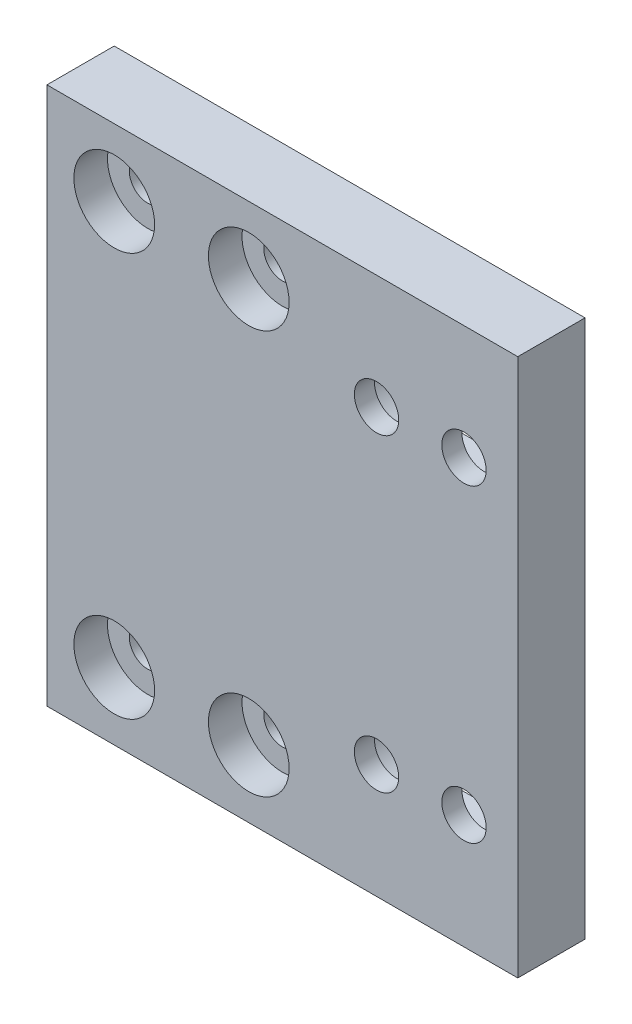
ISO-10303-21;
HEADER;
FILE_DESCRIPTION(('STEP AP214'),'2;1');
FILE_NAME('part.step','',(''),(''),'','','');
FILE_SCHEMA(('AUTOMOTIVE_DESIGN { 1 0 10303 214 1 1 1 1 }'));
ENDSEC;
DATA;
#1=APPLICATION_CONTEXT('core data for automotive mechanical design processes');
#2=APPLICATION_PROTOCOL_DEFINITION('international standard','automotive_design',2000,#1);
#3=PRODUCT_CONTEXT('',#1,'mechanical');
#4=PRODUCT('Part','Part','',(#3));
#5=PRODUCT_RELATED_PRODUCT_CATEGORY('part','',(#4));
#6=PRODUCT_DEFINITION_FORMATION('','',#4);
#7=PRODUCT_DEFINITION_CONTEXT('part definition',#1,'design');
#8=PRODUCT_DEFINITION('design','',#6,#7);
#9=PRODUCT_DEFINITION_SHAPE('','',#8);
#10=(LENGTH_UNIT() NAMED_UNIT(*) SI_UNIT(.MILLI.,.METRE.));
#11=(NAMED_UNIT(*) PLANE_ANGLE_UNIT() SI_UNIT($,.RADIAN.));
#12=(NAMED_UNIT(*) SI_UNIT($,.STERADIAN.) SOLID_ANGLE_UNIT());
#13=UNCERTAINTY_MEASURE_WITH_UNIT(LENGTH_MEASURE(1.E-05),#10,'distance_accuracy_value','');
#14=(GEOMETRIC_REPRESENTATION_CONTEXT(3) GLOBAL_UNCERTAINTY_ASSIGNED_CONTEXT((#13)) GLOBAL_UNIT_ASSIGNED_CONTEXT((#10,
#11,#12)) REPRESENTATION_CONTEXT('',''));
#15=CARTESIAN_POINT('',(0.,0.,0.));
#16=DIRECTION('',(0.,0.,1.));
#17=DIRECTION('',(1.,0.,0.));
#18=AXIS2_PLACEMENT_3D('',#15,#16,#17);
#19=CARTESIAN_POINT('',(0.821863894176577,24.1380472116371,10.));
#20=DIRECTION('',(0.,0.,-1.));
#21=DIRECTION('',(-1.,0.,0.));
#22=AXIS2_PLACEMENT_3D('',#19,#20,#21);
#23=CYLINDRICAL_SURFACE('',#22,3.3);
#24=CARTESIAN_POINT('',(0.821863894176577,24.1380472116371,10.));
#25=DIRECTION('',(0.,0.,1.));
#26=DIRECTION('',(1.,0.,0.));
#27=AXIS2_PLACEMENT_3D('',#24,#25,#26);
#28=CIRCLE('',#27,3.3);
#29=CARTESIAN_POINT('',(4.12186389417658,24.1380472116371,10.));
#30=VERTEX_POINT('',#29);
#31=EDGE_CURVE('E250',#30,#30,#28,.T.);
#32=ORIENTED_EDGE('',*,*,#31,.T.);
#33=EDGE_LOOP('',(#32));
#34=FACE_BOUND('',#33,.T.);
#35=CARTESIAN_POINT('',(0.821863894176577,24.1380472116371,7.));
#36=DIRECTION('',(0.,0.,-1.));
#37=DIRECTION('',(-1.,0.,0.));
#38=AXIS2_PLACEMENT_3D('',#35,#36,#37);
#39=CIRCLE('',#38,3.3);
#40=CARTESIAN_POINT('',(-2.47813610582342,24.1380472116371,7.));
#41=VERTEX_POINT('',#40);
#42=EDGE_CURVE('E200',#41,#41,#39,.T.);
#43=ORIENTED_EDGE('',*,*,#42,.T.);
#44=EDGE_LOOP('',(#43));
#45=FACE_BOUND('',#44,.T.);
#46=ADVANCED_FACE('F37',(#34,#45),#23,.F.);
#47=CARTESIAN_POINT('',(-12.1781361058234,24.1380472116371,10.));
#48=DIRECTION('',(0.,0.,-1.));
#49=DIRECTION('',(-1.,0.,0.));
#50=AXIS2_PLACEMENT_3D('',#47,#48,#49);
#51=CYLINDRICAL_SURFACE('',#50,3.3);
#52=CARTESIAN_POINT('',(-12.1781361058234,24.1380472116371,10.));
#53=DIRECTION('',(0.,0.,1.));
#54=DIRECTION('',(1.,0.,0.));
#55=AXIS2_PLACEMENT_3D('',#52,#53,#54);
#56=CIRCLE('',#55,3.3);
#57=CARTESIAN_POINT('',(-8.87813610582342,24.1380472116371,10.));
#58=VERTEX_POINT('',#57);
#59=EDGE_CURVE('E247',#58,#58,#56,.T.);
#60=ORIENTED_EDGE('',*,*,#59,.T.);
#61=EDGE_LOOP('',(#60));
#62=FACE_BOUND('',#61,.T.);
#63=CARTESIAN_POINT('',(-12.1781361058234,24.1380472116371,7.));
#64=DIRECTION('',(0.,0.,-1.));
#65=DIRECTION('',(-1.,0.,0.));
#66=AXIS2_PLACEMENT_3D('',#63,#64,#65);
#67=CIRCLE('',#66,3.3);
#68=CARTESIAN_POINT('',(-15.4781361058234,24.1380472116371,7.));
#69=VERTEX_POINT('',#68);
#70=EDGE_CURVE('E41',#69,#69,#67,.T.);
#71=ORIENTED_EDGE('',*,*,#70,.T.);
#72=EDGE_LOOP('',(#71));
#73=FACE_BOUND('',#72,.T.);
#74=ADVANCED_FACE('F382',(#62,#73),#51,.F.);
#75=CARTESIAN_POINT('',(-12.1781361058234,-21.8619527883629,10.));
#76=DIRECTION('',(0.,0.,-1.));
#77=DIRECTION('',(-1.,0.,0.));
#78=AXIS2_PLACEMENT_3D('',#75,#76,#77);
#79=CYLINDRICAL_SURFACE('',#78,3.3);
#80=CARTESIAN_POINT('',(-12.1781361058234,-21.8619527883629,10.));
#81=DIRECTION('',(0.,0.,1.));
#82=DIRECTION('',(1.,0.,0.));
#83=AXIS2_PLACEMENT_3D('',#80,#81,#82);
#84=CIRCLE('',#83,3.3);
#85=CARTESIAN_POINT('',(-8.87813610582342,-21.8619527883629,10.));
#86=VERTEX_POINT('',#85);
#87=EDGE_CURVE('E244',#86,#86,#84,.T.);
#88=ORIENTED_EDGE('',*,*,#87,.T.);
#89=EDGE_LOOP('',(#88));
#90=FACE_BOUND('',#89,.T.);
#91=CARTESIAN_POINT('',(-12.1781361058234,-21.8619527883629,7.));
#92=DIRECTION('',(0.,0.,-1.));
#93=DIRECTION('',(-1.,0.,0.));
#94=AXIS2_PLACEMENT_3D('',#91,#92,#93);
#95=CIRCLE('',#94,3.3);
#96=CARTESIAN_POINT('',(-15.4781361058234,-21.8619527883629,7.));
#97=VERTEX_POINT('',#96);
#98=EDGE_CURVE('E197',#97,#97,#95,.T.);
#99=ORIENTED_EDGE('',*,*,#98,.T.);
#100=EDGE_LOOP('',(#99));
#101=FACE_BOUND('',#100,.T.);
#102=ADVANCED_FACE('F373',(#90,#101),#79,.F.);
#103=CARTESIAN_POINT('',(0.821863894176577,-21.8619527883629,10.));
#104=DIRECTION('',(0.,0.,-1.));
#105=DIRECTION('',(-1.,0.,0.));
#106=AXIS2_PLACEMENT_3D('',#103,#104,#105);
#107=CYLINDRICAL_SURFACE('',#106,3.3);
#108=CARTESIAN_POINT('',(0.821863894176577,-21.8619527883629,10.));
#109=DIRECTION('',(0.,0.,1.));
#110=DIRECTION('',(1.,0.,0.));
#111=AXIS2_PLACEMENT_3D('',#108,#109,#110);
#112=CIRCLE('',#111,3.3);
#113=CARTESIAN_POINT('',(4.12186389417658,-21.8619527883629,10.));
#114=VERTEX_POINT('',#113);
#115=EDGE_CURVE('E241',#114,#114,#112,.T.);
#116=ORIENTED_EDGE('',*,*,#115,.T.);
#117=EDGE_LOOP('',(#116));
#118=FACE_BOUND('',#117,.T.);
#119=CARTESIAN_POINT('',(0.821863894176577,-21.8619527883629,7.));
#120=DIRECTION('',(0.,0.,-1.));
#121=DIRECTION('',(-1.,0.,0.));
#122=AXIS2_PLACEMENT_3D('',#119,#120,#121);
#123=CIRCLE('',#122,3.3);
#124=CARTESIAN_POINT('',(-2.47813610582342,-21.8619527883629,7.));
#125=VERTEX_POINT('',#124);
#126=EDGE_CURVE('E164',#125,#125,#123,.T.);
#127=ORIENTED_EDGE('',*,*,#126,.T.);
#128=EDGE_LOOP('',(#127));
#129=FACE_BOUND('',#128,.T.);
#130=ADVANCED_FACE('F291',(#118,#129),#107,.F.);
#131=CARTESIAN_POINT('',(-51.1781361058234,31.1380472116371,10.));
#132=DIRECTION('',(0.,0.,-1.));
#133=DIRECTION('',(-1.,0.,0.));
#134=AXIS2_PLACEMENT_3D('',#131,#132,#133);
#135=CYLINDRICAL_SURFACE('',#134,2.75);
#136=CARTESIAN_POINT('',(-51.1781361058234,31.1380472116371,0.));
#137=DIRECTION('',(0.,0.,1.));
#138=DIRECTION('',(1.,0.,0.));
#139=AXIS2_PLACEMENT_3D('',#136,#137,#138);
#140=CIRCLE('',#139,2.75);
#141=CARTESIAN_POINT('',(-48.4281361058234,31.1380472116371,0.));
#142=VERTEX_POINT('',#141);
#143=EDGE_CURVE('E238',#142,#142,#140,.T.);
#144=ORIENTED_EDGE('',*,*,#143,.F.);
#145=EDGE_LOOP('',(#144));
#146=FACE_BOUND('',#145,.T.);
#147=CARTESIAN_POINT('',(-51.1781361058234,31.1380472116371,5.));
#148=DIRECTION('',(0.,0.,1.));
#149=DIRECTION('',(1.,0.,0.));
#150=AXIS2_PLACEMENT_3D('',#147,#148,#149);
#151=CIRCLE('',#150,2.75);
#152=CARTESIAN_POINT('',(-48.4281361058234,31.1380472116371,5.));
#153=VERTEX_POINT('',#152);
#154=EDGE_CURVE('E232',#153,#153,#151,.T.);
#155=ORIENTED_EDGE('',*,*,#154,.T.);
#156=EDGE_LOOP('',(#155));
#157=FACE_BOUND('',#156,.T.);
#158=ADVANCED_FACE('F372',(#146,#157),#135,.F.);
#159=CARTESIAN_POINT('',(-31.1781361058234,31.1380472116371,10.));
#160=DIRECTION('',(0.,0.,-1.));
#161=DIRECTION('',(-1.,0.,0.));
#162=AXIS2_PLACEMENT_3D('',#159,#160,#161);
#163=CYLINDRICAL_SURFACE('',#162,2.75);
#164=CARTESIAN_POINT('',(-31.1781361058234,31.1380472116371,0.));
#165=DIRECTION('',(0.,0.,1.));
#166=DIRECTION('',(1.,0.,0.));
#167=AXIS2_PLACEMENT_3D('',#164,#165,#166);
#168=CIRCLE('',#167,2.75);
#169=CARTESIAN_POINT('',(-28.4281361058234,31.1380472116371,0.));
#170=VERTEX_POINT('',#169);
#171=EDGE_CURVE('E235',#170,#170,#168,.T.);
#172=ORIENTED_EDGE('',*,*,#171,.F.);
#173=EDGE_LOOP('',(#172));
#174=FACE_BOUND('',#173,.T.);
#175=CARTESIAN_POINT('',(-31.1781361058234,31.1380472116371,5.));
#176=DIRECTION('',(0.,0.,1.));
#177=DIRECTION('',(1.,0.,0.));
#178=AXIS2_PLACEMENT_3D('',#175,#176,#177);
#179=CIRCLE('',#178,2.75);
#180=CARTESIAN_POINT('',(-28.4281361058234,31.1380472116371,5.));
#181=VERTEX_POINT('',#180);
#182=EDGE_CURVE('E284',#181,#181,#179,.T.);
#183=ORIENTED_EDGE('',*,*,#182,.T.);
#184=EDGE_LOOP('',(#183));
#185=FACE_BOUND('',#184,.T.);
#186=ADVANCED_FACE('F379',(#174,#185),#163,.F.);
#187=CARTESIAN_POINT('',(-31.1781361058234,-28.8619527883629,10.));
#188=DIRECTION('',(0.,0.,-1.));
#189=DIRECTION('',(-1.,0.,0.));
#190=AXIS2_PLACEMENT_3D('',#187,#188,#189);
#191=CYLINDRICAL_SURFACE('',#190,2.75);
#192=CARTESIAN_POINT('',(-31.1781361058234,-28.8619527883629,0.));
#193=DIRECTION('',(0.,0.,1.));
#194=DIRECTION('',(1.,0.,0.));
#195=AXIS2_PLACEMENT_3D('',#192,#193,#194);
#196=CIRCLE('',#195,2.75);
#197=CARTESIAN_POINT('',(-28.4281361058234,-28.8619527883629,0.));
#198=VERTEX_POINT('',#197);
#199=EDGE_CURVE('E231',#198,#198,#196,.T.);
#200=ORIENTED_EDGE('',*,*,#199,.F.);
#201=EDGE_LOOP('',(#200));
#202=FACE_BOUND('',#201,.T.);
#203=CARTESIAN_POINT('',(-31.1781361058234,-28.8619527883629,5.));
#204=DIRECTION('',(0.,0.,1.));
#205=DIRECTION('',(1.,0.,0.));
#206=AXIS2_PLACEMENT_3D('',#203,#204,#205);
#207=CIRCLE('',#206,2.75);
#208=CARTESIAN_POINT('',(-28.4281361058234,-28.8619527883629,5.));
#209=VERTEX_POINT('',#208);
#210=EDGE_CURVE('E281',#209,#209,#207,.T.);
#211=ORIENTED_EDGE('',*,*,#210,.T.);
#212=EDGE_LOOP('',(#211));
#213=FACE_BOUND('',#212,.T.);
#214=ADVANCED_FACE('F333',(#202,#213),#191,.F.);
#215=CARTESIAN_POINT('',(-51.1781361058234,-28.8619527883629,10.));
#216=DIRECTION('',(0.,0.,-1.));
#217=DIRECTION('',(-1.,0.,0.));
#218=AXIS2_PLACEMENT_3D('',#215,#216,#217);
#219=CYLINDRICAL_SURFACE('',#218,2.75);
#220=CARTESIAN_POINT('',(-51.1781361058234,-28.8619527883629,0.));
#221=DIRECTION('',(0.,0.,1.));
#222=DIRECTION('',(1.,0.,0.));
#223=AXIS2_PLACEMENT_3D('',#220,#221,#222);
#224=CIRCLE('',#223,2.75);
#225=CARTESIAN_POINT('',(-48.4281361058234,-28.8619527883629,0.));
#226=VERTEX_POINT('',#225);
#227=EDGE_CURVE('E228',#226,#226,#224,.T.);
#228=ORIENTED_EDGE('',*,*,#227,.F.);
#229=EDGE_LOOP('',(#228));
#230=FACE_BOUND('',#229,.T.);
#231=CARTESIAN_POINT('',(-51.1781361058234,-28.8619527883629,5.));
#232=DIRECTION('',(0.,0.,1.));
#233=DIRECTION('',(1.,0.,0.));
#234=AXIS2_PLACEMENT_3D('',#231,#232,#233);
#235=CIRCLE('',#234,2.75);
#236=CARTESIAN_POINT('',(-48.4281361058234,-28.8619527883629,5.));
#237=VERTEX_POINT('',#236);
#238=EDGE_CURVE('E225',#237,#237,#235,.T.);
#239=ORIENTED_EDGE('',*,*,#238,.T.);
#240=EDGE_LOOP('',(#239));
#241=FACE_BOUND('',#240,.T.);
#242=ADVANCED_FACE('F330',(#230,#241),#219,.F.);
#243=CARTESIAN_POINT('',(0.,0.,10.));
#244=DIRECTION('',(0.,0.,1.));
#245=DIRECTION('',(1.,0.,0.));
#246=AXIS2_PLACEMENT_3D('',#243,#244,#245);
#247=PLANE('',#246);
#248=CARTESIAN_POINT('',(-51.1781361058234,-28.8619527883629,10.));
#249=DIRECTION('',(0.,0.,1.));
#250=DIRECTION('',(1.,0.,0.));
#251=AXIS2_PLACEMENT_3D('',#248,#249,#250);
#252=CIRCLE('',#251,6.);
#253=CARTESIAN_POINT('',(-45.1781361058234,-28.8619527883629,10.));
#254=VERTEX_POINT('',#253);
#255=EDGE_CURVE('E203',#254,#254,#252,.T.);
#256=ORIENTED_EDGE('',*,*,#255,.F.);
#257=EDGE_LOOP('',(#256));
#258=FACE_BOUND('',#257,.T.);
#259=CARTESIAN_POINT('',(-31.1781361058234,-28.8619527883629,10.));
#260=DIRECTION('',(0.,0.,1.));
#261=DIRECTION('',(1.,0.,0.));
#262=AXIS2_PLACEMENT_3D('',#259,#260,#261);
#263=CIRCLE('',#262,6.);
#264=CARTESIAN_POINT('',(-25.1781361058234,-28.8619527883629,10.));
#265=VERTEX_POINT('',#264);
#266=EDGE_CURVE('E214',#265,#265,#263,.T.);
#267=ORIENTED_EDGE('',*,*,#266,.F.);
#268=EDGE_LOOP('',(#267));
#269=FACE_BOUND('',#268,.T.);
#270=CARTESIAN_POINT('',(-31.1781361058234,31.1380472116371,10.));
#271=DIRECTION('',(0.,0.,1.));
#272=DIRECTION('',(1.,0.,0.));
#273=AXIS2_PLACEMENT_3D('',#270,#271,#272);
#274=CIRCLE('',#273,6.);
#275=CARTESIAN_POINT('',(-25.1781361058234,31.1380472116371,10.));
#276=VERTEX_POINT('',#275);
#277=EDGE_CURVE('E208',#276,#276,#274,.T.);
#278=ORIENTED_EDGE('',*,*,#277,.F.);
#279=EDGE_LOOP('',(#278));
#280=FACE_BOUND('',#279,.T.);
#281=CARTESIAN_POINT('',(-51.1781361058234,31.1380472116371,10.));
#282=DIRECTION('',(0.,0.,1.));
#283=DIRECTION('',(1.,0.,0.));
#284=AXIS2_PLACEMENT_3D('',#281,#282,#283);
#285=CIRCLE('',#284,6.);
#286=CARTESIAN_POINT('',(-45.1781361058234,31.1380472116371,10.));
#287=VERTEX_POINT('',#286);
#288=EDGE_CURVE('E207',#287,#287,#285,.T.);
#289=ORIENTED_EDGE('',*,*,#288,.F.);
#290=EDGE_LOOP('',(#289));
#291=FACE_BOUND('',#290,.T.);
#292=ORIENTED_EDGE('',*,*,#87,.F.);
#293=EDGE_LOOP('',(#292));
#294=FACE_BOUND('',#293,.T.);
#295=ORIENTED_EDGE('',*,*,#31,.F.);
#296=EDGE_LOOP('',(#295));
#297=FACE_BOUND('',#296,.T.);
#298=DIRECTION('',(0.,-1.,0.));
#299=VECTOR('',#298,1.);
#300=CARTESIAN_POINT('',(-61.1781361058234,41.1380472116371,10.));
#301=LINE('',#300,#299);
#302=CARTESIAN_POINT('',(-61.1781361058234,41.1380472116371,10.));
#303=VERTEX_POINT('',#302);
#304=CARTESIAN_POINT('',(-61.1781361058234,-38.8619527883629,10.));
#305=VERTEX_POINT('',#304);
#306=EDGE_CURVE('E254',#303,#305,#301,.T.);
#307=ORIENTED_EDGE('',*,*,#306,.T.);
#308=DIRECTION('',(1.,0.,0.));
#309=VECTOR('',#308,1.);
#310=CARTESIAN_POINT('',(-61.1781361058234,-38.8619527883629,10.));
#311=LINE('',#310,#309);
#312=CARTESIAN_POINT('',(8.82186389417659,-38.8619527883629,10.));
#313=VERTEX_POINT('',#312);
#314=EDGE_CURVE('E257',#305,#313,#311,.T.);
#315=ORIENTED_EDGE('',*,*,#314,.T.);
#316=DIRECTION('',(0.,1.,0.));
#317=VECTOR('',#316,1.);
#318=CARTESIAN_POINT('',(8.82186389417659,41.1380472116371,10.));
#319=LINE('',#318,#317);
#320=CARTESIAN_POINT('',(8.82186389417659,41.1380472116371,10.));
#321=VERTEX_POINT('',#320);
#322=EDGE_CURVE('E260',#313,#321,#319,.T.);
#323=ORIENTED_EDGE('',*,*,#322,.T.);
#324=DIRECTION('',(-1.,0.,0.));
#325=VECTOR('',#324,1.);
#326=CARTESIAN_POINT('',(-61.1781361058234,41.1380472116371,10.));
#327=LINE('',#326,#325);
#328=EDGE_CURVE('E262',#321,#303,#327,.T.);
#329=ORIENTED_EDGE('',*,*,#328,.T.);
#330=EDGE_LOOP('',(#307,#315,#323,#329));
#331=FACE_BOUND('',#330,.T.);
#332=ORIENTED_EDGE('',*,*,#59,.F.);
#333=EDGE_LOOP('',(#332));
#334=FACE_BOUND('',#333,.T.);
#335=ORIENTED_EDGE('',*,*,#115,.F.);
#336=EDGE_LOOP('',(#335));
#337=FACE_BOUND('',#336,.T.);
#338=ADVANCED_FACE('F316',(#258,#269,#280,#291,#294,#297,#331,#334,#337),#247,.T.);
#339=CARTESIAN_POINT('',(0.,0.,0.));
#340=DIRECTION('',(0.,0.,1.));
#341=DIRECTION('',(1.,0.,0.));
#342=AXIS2_PLACEMENT_3D('',#339,#340,#341);
#343=PLANE('',#342);
#344=DIRECTION('',(-1.,0.,0.));
#345=VECTOR('',#344,1.);
#346=CARTESIAN_POINT('',(0.821863894176577,17.1380472116371,0.));
#347=LINE('',#346,#345);
#348=CARTESIAN_POINT('',(0.821863894176577,17.1380472116371,0.));
#349=VERTEX_POINT('',#348);
#350=CARTESIAN_POINT('',(-12.1781361058234,17.1380472116371,0.));
#351=VERTEX_POINT('',#350);
#352=EDGE_CURVE('E157',#349,#351,#347,.T.);
#353=ORIENTED_EDGE('',*,*,#352,.F.);
#354=CARTESIAN_POINT('',(0.821863894176577,24.1380472116371,0.));
#355=DIRECTION('',(0.,0.,-1.));
#356=DIRECTION('',(-1.,0.,0.));
#357=AXIS2_PLACEMENT_3D('',#354,#355,#356);
#358=CIRCLE('',#357,7.);
#359=CARTESIAN_POINT('',(0.821863894176577,31.1380472116371,0.));
#360=VERTEX_POINT('',#359);
#361=EDGE_CURVE('E54',#360,#349,#358,.T.);
#362=ORIENTED_EDGE('',*,*,#361,.F.);
#363=DIRECTION('',(1.,0.,0.));
#364=VECTOR('',#363,1.);
#365=CARTESIAN_POINT('',(0.821863894176577,31.1380472116371,0.));
#366=LINE('',#365,#364);
#367=CARTESIAN_POINT('',(-12.1781361058234,31.1380472116371,0.));
#368=VERTEX_POINT('',#367);
#369=EDGE_CURVE('E148',#368,#360,#366,.T.);
#370=ORIENTED_EDGE('',*,*,#369,.F.);
#371=CARTESIAN_POINT('',(-12.1781361058234,24.1380472116371,0.));
#372=DIRECTION('',(0.,0.,-1.));
#373=DIRECTION('',(1.,0.,0.));
#374=AXIS2_PLACEMENT_3D('',#371,#372,#373);
#375=CIRCLE('',#374,7.);
#376=EDGE_CURVE('E151',#351,#368,#375,.T.);
#377=ORIENTED_EDGE('',*,*,#376,.F.);
#378=EDGE_LOOP('',(#353,#362,#370,#377));
#379=FACE_BOUND('',#378,.T.);
#380=DIRECTION('',(-1.,0.,0.));
#381=VECTOR('',#380,1.);
#382=CARTESIAN_POINT('',(0.821863894176577,-28.8619527883629,0.));
#383=LINE('',#382,#381);
#384=CARTESIAN_POINT('',(0.821863894176577,-28.8619527883629,0.));
#385=VERTEX_POINT('',#384);
#386=CARTESIAN_POINT('',(-12.1781361058234,-28.8619527883629,0.));
#387=VERTEX_POINT('',#386);
#388=EDGE_CURVE('E183',#385,#387,#383,.T.);
#389=ORIENTED_EDGE('',*,*,#388,.F.);
#390=CARTESIAN_POINT('',(0.821863894176576,-21.8619527883629,0.));
#391=DIRECTION('',(0.,0.,-1.));
#392=DIRECTION('',(-1.,0.,0.));
#393=AXIS2_PLACEMENT_3D('',#390,#391,#392);
#394=CIRCLE('',#393,7.);
#395=CARTESIAN_POINT('',(0.821863894176577,-14.8619527883629,0.));
#396=VERTEX_POINT('',#395);
#397=EDGE_CURVE('E62',#396,#385,#394,.T.);
#398=ORIENTED_EDGE('',*,*,#397,.F.);
#399=DIRECTION('',(1.,0.,0.));
#400=VECTOR('',#399,1.);
#401=CARTESIAN_POINT('',(0.821863894176577,-14.8619527883629,0.));
#402=LINE('',#401,#400);
#403=CARTESIAN_POINT('',(-12.1781361058234,-14.8619527883629,0.));
#404=VERTEX_POINT('',#403);
#405=EDGE_CURVE('E172',#404,#396,#402,.T.);
#406=ORIENTED_EDGE('',*,*,#405,.F.);
#407=CARTESIAN_POINT('',(-12.1781361058234,-21.8619527883629,0.));
#408=DIRECTION('',(0.,0.,-1.));
#409=DIRECTION('',(-1.,0.,0.));
#410=AXIS2_PLACEMENT_3D('',#407,#408,#409);
#411=CIRCLE('',#410,7.);
#412=EDGE_CURVE('E186',#387,#404,#411,.T.);
#413=ORIENTED_EDGE('',*,*,#412,.F.);
#414=EDGE_LOOP('',(#389,#398,#406,#413));
#415=FACE_BOUND('',#414,.T.);
#416=DIRECTION('',(0.,-1.,0.));
#417=VECTOR('',#416,1.);
#418=CARTESIAN_POINT('',(-61.1781361058234,41.1380472116371,0.));
#419=LINE('',#418,#417);
#420=CARTESIAN_POINT('',(-61.1781361058234,41.1380472116371,0.));
#421=VERTEX_POINT('',#420);
#422=CARTESIAN_POINT('',(-61.1781361058234,-38.8619527883629,0.));
#423=VERTEX_POINT('',#422);
#424=EDGE_CURVE('E253',#421,#423,#419,.T.);
#425=ORIENTED_EDGE('',*,*,#424,.F.);
#426=DIRECTION('',(-1.,0.,0.));
#427=VECTOR('',#426,1.);
#428=CARTESIAN_POINT('',(-61.1781361058234,41.1380472116371,0.));
#429=LINE('',#428,#427);
#430=CARTESIAN_POINT('',(8.82186389417659,41.1380472116371,0.));
#431=VERTEX_POINT('',#430);
#432=EDGE_CURVE('E258',#431,#421,#429,.T.);
#433=ORIENTED_EDGE('',*,*,#432,.F.);
#434=DIRECTION('',(0.,1.,0.));
#435=VECTOR('',#434,1.);
#436=CARTESIAN_POINT('',(8.82186389417659,41.1380472116371,0.));
#437=LINE('',#436,#435);
#438=CARTESIAN_POINT('',(8.82186389417659,-38.8619527883629,0.));
#439=VERTEX_POINT('',#438);
#440=EDGE_CURVE('E269',#439,#431,#437,.T.);
#441=ORIENTED_EDGE('',*,*,#440,.F.);
#442=DIRECTION('',(1.,0.,0.));
#443=VECTOR('',#442,1.);
#444=CARTESIAN_POINT('',(-61.1781361058234,-38.8619527883629,0.));
#445=LINE('',#444,#443);
#446=EDGE_CURVE('E267',#423,#439,#445,.T.);
#447=ORIENTED_EDGE('',*,*,#446,.F.);
#448=EDGE_LOOP('',(#425,#433,#441,#447));
#449=FACE_BOUND('',#448,.T.);
#450=ORIENTED_EDGE('',*,*,#143,.T.);
#451=EDGE_LOOP('',(#450));
#452=FACE_BOUND('',#451,.T.);
#453=ORIENTED_EDGE('',*,*,#171,.T.);
#454=EDGE_LOOP('',(#453));
#455=FACE_BOUND('',#454,.T.);
#456=ORIENTED_EDGE('',*,*,#199,.T.);
#457=EDGE_LOOP('',(#456));
#458=FACE_BOUND('',#457,.T.);
#459=ORIENTED_EDGE('',*,*,#227,.T.);
#460=EDGE_LOOP('',(#459));
#461=FACE_BOUND('',#460,.T.);
#462=ADVANCED_FACE('F313',(#379,#415,#449,#452,#455,#458,#461),#343,.F.);
#463=CARTESIAN_POINT('',(-61.1781361058234,41.1380472116371,10.));
#464=DIRECTION('',(1.,0.,0.));
#465=DIRECTION('',(0.,0.,-1.));
#466=AXIS2_PLACEMENT_3D('',#463,#464,#465);
#467=PLANE('',#466);
#468=ORIENTED_EDGE('',*,*,#424,.T.);
#469=DIRECTION('',(0.,0.,-1.));
#470=VECTOR('',#469,1.);
#471=CARTESIAN_POINT('',(-61.1781361058234,-38.8619527883629,10.));
#472=LINE('',#471,#470);
#473=EDGE_CURVE('E11',#305,#423,#472,.T.);
#474=ORIENTED_EDGE('',*,*,#473,.F.);
#475=ORIENTED_EDGE('',*,*,#306,.F.);
#476=DIRECTION('',(0.,0.,-1.));
#477=VECTOR('',#476,1.);
#478=CARTESIAN_POINT('',(-61.1781361058234,41.1380472116371,10.));
#479=LINE('',#478,#477);
#480=EDGE_CURVE('E264',#303,#421,#479,.T.);
#481=ORIENTED_EDGE('',*,*,#480,.T.);
#482=EDGE_LOOP('',(#468,#474,#475,#481));
#483=FACE_BOUND('',#482,.T.);
#484=ADVANCED_FACE('F39',(#483),#467,.F.);
#485=CARTESIAN_POINT('',(-61.1781361058234,-38.8619527883629,10.));
#486=DIRECTION('',(0.,1.,0.));
#487=DIRECTION('',(0.,0.,1.));
#488=AXIS2_PLACEMENT_3D('',#485,#486,#487);
#489=PLANE('',#488);
#490=ORIENTED_EDGE('',*,*,#446,.T.);
#491=DIRECTION('',(0.,0.,-1.));
#492=VECTOR('',#491,1.);
#493=CARTESIAN_POINT('',(8.82186389417659,-38.8619527883629,10.));
#494=LINE('',#493,#492);
#495=EDGE_CURVE('E46',#313,#439,#494,.T.);
#496=ORIENTED_EDGE('',*,*,#495,.F.);
#497=ORIENTED_EDGE('',*,*,#314,.F.);
#498=ORIENTED_EDGE('',*,*,#473,.T.);
#499=EDGE_LOOP('',(#490,#496,#497,#498));
#500=FACE_BOUND('',#499,.T.);
#501=ADVANCED_FACE('F400',(#500),#489,.F.);
#502=CARTESIAN_POINT('',(8.82186389417659,41.1380472116371,10.));
#503=DIRECTION('',(-1.,0.,0.));
#504=DIRECTION('',(0.,0.,1.));
#505=AXIS2_PLACEMENT_3D('',#502,#503,#504);
#506=PLANE('',#505);
#507=ORIENTED_EDGE('',*,*,#440,.T.);
#508=DIRECTION('',(0.,0.,-1.));
#509=VECTOR('',#508,1.);
#510=CARTESIAN_POINT('',(8.82186389417659,41.1380472116371,10.));
#511=LINE('',#510,#509);
#512=EDGE_CURVE('E274',#321,#431,#511,.T.);
#513=ORIENTED_EDGE('',*,*,#512,.F.);
#514=ORIENTED_EDGE('',*,*,#322,.F.);
#515=ORIENTED_EDGE('',*,*,#495,.T.);
#516=EDGE_LOOP('',(#507,#513,#514,#515));
#517=FACE_BOUND('',#516,.T.);
#518=ADVANCED_FACE('F397',(#517),#506,.F.);
#519=CARTESIAN_POINT('',(-61.1781361058234,41.1380472116371,10.));
#520=DIRECTION('',(0.,-1.,0.));
#521=DIRECTION('',(0.,0.,-1.));
#522=AXIS2_PLACEMENT_3D('',#519,#520,#521);
#523=PLANE('',#522);
#524=ORIENTED_EDGE('',*,*,#432,.T.);
#525=ORIENTED_EDGE('',*,*,#480,.F.);
#526=ORIENTED_EDGE('',*,*,#328,.F.);
#527=ORIENTED_EDGE('',*,*,#512,.T.);
#528=EDGE_LOOP('',(#524,#525,#526,#527));
#529=FACE_BOUND('',#528,.T.);
#530=ADVANCED_FACE('F347',(#529),#523,.F.);
#531=CARTESIAN_POINT('',(-51.1781361058234,-28.8619527883629,5.));
#532=DIRECTION('',(0.,0.,1.));
#533=DIRECTION('',(1.,0.,0.));
#534=AXIS2_PLACEMENT_3D('',#531,#532,#533);
#535=CYLINDRICAL_SURFACE('',#534,6.);
#536=CARTESIAN_POINT('',(-51.1781361058234,-28.8619527883629,5.));
#537=DIRECTION('',(0.,0.,1.));
#538=DIRECTION('',(1.,0.,0.));
#539=AXIS2_PLACEMENT_3D('',#536,#537,#538);
#540=CIRCLE('',#539,6.);
#541=CARTESIAN_POINT('',(-45.1781361058234,-28.8619527883629,5.));
#542=VERTEX_POINT('',#541);
#543=EDGE_CURVE('E217',#542,#542,#540,.T.);
#544=ORIENTED_EDGE('',*,*,#543,.F.);
#545=EDGE_LOOP('',(#544));
#546=FACE_BOUND('',#545,.T.);
#547=ORIENTED_EDGE('',*,*,#255,.T.);
#548=EDGE_LOOP('',(#547));
#549=FACE_BOUND('',#548,.T.);
#550=ADVANCED_FACE('F341',(#546,#549),#535,.F.);
#551=CARTESIAN_POINT('',(-51.1781361058234,-28.8619527883629,5.));
#552=DIRECTION('',(0.,0.,1.));
#553=DIRECTION('',(1.,0.,0.));
#554=AXIS2_PLACEMENT_3D('',#551,#552,#553);
#555=PLANE('',#554);
#556=ORIENTED_EDGE('',*,*,#238,.F.);
#557=EDGE_LOOP('',(#556));
#558=FACE_BOUND('',#557,.T.);
#559=ORIENTED_EDGE('',*,*,#543,.T.);
#560=EDGE_LOOP('',(#559));
#561=FACE_BOUND('',#560,.T.);
#562=ADVANCED_FACE('F337',(#558,#561),#555,.T.);
#563=CARTESIAN_POINT('',(-31.1781361058234,-28.8619527883629,5.));
#564=DIRECTION('',(0.,0.,1.));
#565=DIRECTION('',(1.,0.,0.));
#566=AXIS2_PLACEMENT_3D('',#563,#564,#565);
#567=CYLINDRICAL_SURFACE('',#566,6.);
#568=CARTESIAN_POINT('',(-31.1781361058234,-28.8619527883629,5.));
#569=DIRECTION('',(0.,0.,1.));
#570=DIRECTION('',(1.,0.,0.));
#571=AXIS2_PLACEMENT_3D('',#568,#569,#570);
#572=CIRCLE('',#571,6.);
#573=CARTESIAN_POINT('',(-25.1781361058234,-28.8619527883629,5.));
#574=VERTEX_POINT('',#573);
#575=EDGE_CURVE('E211',#574,#574,#572,.T.);
#576=ORIENTED_EDGE('',*,*,#575,.F.);
#577=EDGE_LOOP('',(#576));
#578=FACE_BOUND('',#577,.T.);
#579=ORIENTED_EDGE('',*,*,#266,.T.);
#580=EDGE_LOOP('',(#579));
#581=FACE_BOUND('',#580,.T.);
#582=ADVANCED_FACE('F340',(#578,#581),#567,.F.);
#583=CARTESIAN_POINT('',(-31.1781361058234,-28.8619527883629,5.));
#584=DIRECTION('',(0.,0.,1.));
#585=DIRECTION('',(1.,0.,0.));
#586=AXIS2_PLACEMENT_3D('',#583,#584,#585);
#587=PLANE('',#586);
#588=ORIENTED_EDGE('',*,*,#210,.F.);
#589=EDGE_LOOP('',(#588));
#590=FACE_BOUND('',#589,.T.);
#591=ORIENTED_EDGE('',*,*,#575,.T.);
#592=EDGE_LOOP('',(#591));
#593=FACE_BOUND('',#592,.T.);
#594=ADVANCED_FACE('F485',(#590,#593),#587,.T.);
#595=CARTESIAN_POINT('',(-31.1781361058234,31.1380472116371,5.));
#596=DIRECTION('',(0.,0.,1.));
#597=DIRECTION('',(1.,0.,0.));
#598=AXIS2_PLACEMENT_3D('',#595,#596,#597);
#599=CYLINDRICAL_SURFACE('',#598,6.);
#600=CARTESIAN_POINT('',(-31.1781361058234,31.1380472116371,5.));
#601=DIRECTION('',(0.,0.,1.));
#602=DIRECTION('',(1.,0.,0.));
#603=AXIS2_PLACEMENT_3D('',#600,#601,#602);
#604=CIRCLE('',#603,6.);
#605=CARTESIAN_POINT('',(-25.1781361058234,31.1380472116371,5.));
#606=VERTEX_POINT('',#605);
#607=EDGE_CURVE('E204',#606,#606,#604,.T.);
#608=ORIENTED_EDGE('',*,*,#607,.F.);
#609=EDGE_LOOP('',(#608));
#610=FACE_BOUND('',#609,.T.);
#611=ORIENTED_EDGE('',*,*,#277,.T.);
#612=EDGE_LOOP('',(#611));
#613=FACE_BOUND('',#612,.T.);
#614=ADVANCED_FACE('F493',(#610,#613),#599,.F.);
#615=CARTESIAN_POINT('',(-31.1781361058234,31.1380472116371,5.));
#616=DIRECTION('',(0.,0.,1.));
#617=DIRECTION('',(1.,0.,0.));
#618=AXIS2_PLACEMENT_3D('',#615,#616,#617);
#619=PLANE('',#618);
#620=ORIENTED_EDGE('',*,*,#182,.F.);
#621=EDGE_LOOP('',(#620));
#622=FACE_BOUND('',#621,.T.);
#623=ORIENTED_EDGE('',*,*,#607,.T.);
#624=EDGE_LOOP('',(#623));
#625=FACE_BOUND('',#624,.T.);
#626=ADVANCED_FACE('F501',(#622,#625),#619,.T.);
#627=CARTESIAN_POINT('',(-51.1781361058234,31.1380472116371,5.));
#628=DIRECTION('',(0.,0.,1.));
#629=DIRECTION('',(1.,0.,0.));
#630=AXIS2_PLACEMENT_3D('',#627,#628,#629);
#631=CYLINDRICAL_SURFACE('',#630,6.);
#632=CARTESIAN_POINT('',(-51.1781361058234,31.1380472116371,5.));
#633=DIRECTION('',(0.,0.,1.));
#634=DIRECTION('',(1.,0.,0.));
#635=AXIS2_PLACEMENT_3D('',#632,#633,#634);
#636=CIRCLE('',#635,6.);
#637=CARTESIAN_POINT('',(-45.1781361058234,31.1380472116371,5.));
#638=VERTEX_POINT('',#637);
#639=EDGE_CURVE('E222',#638,#638,#636,.T.);
#640=ORIENTED_EDGE('',*,*,#639,.F.);
#641=EDGE_LOOP('',(#640));
#642=FACE_BOUND('',#641,.T.);
#643=ORIENTED_EDGE('',*,*,#288,.T.);
#644=EDGE_LOOP('',(#643));
#645=FACE_BOUND('',#644,.T.);
#646=ADVANCED_FACE('F509',(#642,#645),#631,.F.);
#647=CARTESIAN_POINT('',(-51.1781361058234,31.1380472116371,5.));
#648=DIRECTION('',(0.,0.,1.));
#649=DIRECTION('',(1.,0.,0.));
#650=AXIS2_PLACEMENT_3D('',#647,#648,#649);
#651=PLANE('',#650);
#652=ORIENTED_EDGE('',*,*,#154,.F.);
#653=EDGE_LOOP('',(#652));
#654=FACE_BOUND('',#653,.T.);
#655=ORIENTED_EDGE('',*,*,#639,.T.);
#656=EDGE_LOOP('',(#655));
#657=FACE_BOUND('',#656,.T.);
#658=ADVANCED_FACE('F517',(#654,#657),#651,.T.);
#659=CARTESIAN_POINT('',(0.821863894176576,-21.8619527883629,7.));
#660=DIRECTION('',(0.,0.,-1.));
#661=DIRECTION('',(-1.,0.,0.));
#662=AXIS2_PLACEMENT_3D('',#659,#660,#661);
#663=CYLINDRICAL_SURFACE('',#662,7.);
#664=ORIENTED_EDGE('',*,*,#397,.T.);
#665=DIRECTION('',(0.,0.,-1.));
#666=VECTOR('',#665,1.);
#667=CARTESIAN_POINT('',(0.821863894176577,-28.8619527883629,7.));
#668=LINE('',#667,#666);
#669=CARTESIAN_POINT('',(0.821863894176577,-28.8619527883629,7.));
#670=VERTEX_POINT('',#669);
#671=EDGE_CURVE('E181',#670,#385,#668,.T.);
#672=ORIENTED_EDGE('',*,*,#671,.F.);
#673=CARTESIAN_POINT('',(0.821863894176576,-21.8619527883629,7.));
#674=DIRECTION('',(0.,0.,-1.));
#675=DIRECTION('',(-1.,0.,0.));
#676=AXIS2_PLACEMENT_3D('',#673,#674,#675);
#677=CIRCLE('',#676,7.);
#678=CARTESIAN_POINT('',(0.821863894176577,-14.8619527883629,7.));
#679=VERTEX_POINT('',#678);
#680=EDGE_CURVE('E168',#679,#670,#677,.T.);
#681=ORIENTED_EDGE('',*,*,#680,.F.);
#682=DIRECTION('',(0.,0.,-1.));
#683=VECTOR('',#682,1.);
#684=CARTESIAN_POINT('',(0.821863894176577,-14.8619527883629,7.));
#685=LINE('',#684,#683);
#686=EDGE_CURVE('E158',#679,#396,#685,.T.);
#687=ORIENTED_EDGE('',*,*,#686,.T.);
#688=EDGE_LOOP('',(#664,#672,#681,#687));
#689=FACE_BOUND('',#688,.T.);
#690=ADVANCED_FACE('F302',(#689),#663,.F.);
#691=CARTESIAN_POINT('',(0.821863894176577,-14.8619527883629,7.));
#692=DIRECTION('',(0.,1.,0.));
#693=DIRECTION('',(0.,0.,1.));
#694=AXIS2_PLACEMENT_3D('',#691,#692,#693);
#695=PLANE('',#694);
#696=ORIENTED_EDGE('',*,*,#405,.T.);
#697=ORIENTED_EDGE('',*,*,#686,.F.);
#698=DIRECTION('',(1.,0.,0.));
#699=VECTOR('',#698,1.);
#700=CARTESIAN_POINT('',(0.821863894176577,-14.8619527883629,7.));
#701=LINE('',#700,#699);
#702=CARTESIAN_POINT('',(-12.1781361058234,-14.8619527883629,7.));
#703=VERTEX_POINT('',#702);
#704=EDGE_CURVE('E178',#703,#679,#701,.T.);
#705=ORIENTED_EDGE('',*,*,#704,.F.);
#706=DIRECTION('',(0.,0.,-1.));
#707=VECTOR('',#706,1.);
#708=CARTESIAN_POINT('',(-12.1781361058234,-14.8619527883629,7.));
#709=LINE('',#708,#707);
#710=EDGE_CURVE('E192',#703,#404,#709,.T.);
#711=ORIENTED_EDGE('',*,*,#710,.T.);
#712=EDGE_LOOP('',(#696,#697,#705,#711));
#713=FACE_BOUND('',#712,.T.);
#714=ADVANCED_FACE('F310',(#713),#695,.F.);
#715=CARTESIAN_POINT('',(-12.1781361058234,-21.8619527883629,7.));
#716=DIRECTION('',(0.,0.,-1.));
#717=DIRECTION('',(-1.,0.,0.));
#718=AXIS2_PLACEMENT_3D('',#715,#716,#717);
#719=CYLINDRICAL_SURFACE('',#718,7.);
#720=ORIENTED_EDGE('',*,*,#412,.T.);
#721=ORIENTED_EDGE('',*,*,#710,.F.);
#722=CARTESIAN_POINT('',(-12.1781361058234,-21.8619527883629,7.));
#723=DIRECTION('',(0.,0.,-1.));
#724=DIRECTION('',(-1.,0.,0.));
#725=AXIS2_PLACEMENT_3D('',#722,#723,#724);
#726=CIRCLE('',#725,7.);
#727=CARTESIAN_POINT('',(-12.1781361058234,-28.8619527883629,7.));
#728=VERTEX_POINT('',#727);
#729=EDGE_CURVE('E175',#728,#703,#726,.T.);
#730=ORIENTED_EDGE('',*,*,#729,.F.);
#731=DIRECTION('',(0.,0.,-1.));
#732=VECTOR('',#731,1.);
#733=CARTESIAN_POINT('',(-12.1781361058234,-28.8619527883629,7.));
#734=LINE('',#733,#732);
#735=EDGE_CURVE('E194',#728,#387,#734,.T.);
#736=ORIENTED_EDGE('',*,*,#735,.T.);
#737=EDGE_LOOP('',(#720,#721,#730,#736));
#738=FACE_BOUND('',#737,.T.);
#739=ADVANCED_FACE('F308',(#738),#719,.F.);
#740=CARTESIAN_POINT('',(0.821863894176577,-28.8619527883629,7.));
#741=DIRECTION('',(0.,-1.,0.));
#742=DIRECTION('',(0.,0.,-1.));
#743=AXIS2_PLACEMENT_3D('',#740,#741,#742);
#744=PLANE('',#743);
#745=ORIENTED_EDGE('',*,*,#388,.T.);
#746=ORIENTED_EDGE('',*,*,#735,.F.);
#747=DIRECTION('',(-1.,0.,0.));
#748=VECTOR('',#747,1.);
#749=CARTESIAN_POINT('',(0.821863894176577,-28.8619527883629,7.));
#750=LINE('',#749,#748);
#751=EDGE_CURVE('E171',#670,#728,#750,.T.);
#752=ORIENTED_EDGE('',*,*,#751,.F.);
#753=ORIENTED_EDGE('',*,*,#671,.T.);
#754=EDGE_LOOP('',(#745,#746,#752,#753));
#755=FACE_BOUND('',#754,.T.);
#756=ADVANCED_FACE('F296',(#755),#744,.F.);
#757=CARTESIAN_POINT('',(0.821863894176576,-21.8619527883629,7.));
#758=DIRECTION('',(0.,0.,-1.));
#759=DIRECTION('',(-1.,0.,0.));
#760=AXIS2_PLACEMENT_3D('',#757,#758,#759);
#761=PLANE('',#760);
#762=ORIENTED_EDGE('',*,*,#98,.F.);
#763=EDGE_LOOP('',(#762));
#764=FACE_BOUND('',#763,.T.);
#765=ORIENTED_EDGE('',*,*,#126,.F.);
#766=EDGE_LOOP('',(#765));
#767=FACE_BOUND('',#766,.T.);
#768=ORIENTED_EDGE('',*,*,#680,.T.);
#769=ORIENTED_EDGE('',*,*,#751,.T.);
#770=ORIENTED_EDGE('',*,*,#729,.T.);
#771=ORIENTED_EDGE('',*,*,#704,.T.);
#772=EDGE_LOOP('',(#768,#769,#770,#771));
#773=FACE_BOUND('',#772,.T.);
#774=ADVANCED_FACE('F293',(#764,#767,#773),#761,.T.);
#775=CARTESIAN_POINT('',(0.821863894176577,24.1380472116371,7.));
#776=DIRECTION('',(0.,0.,-1.));
#777=DIRECTION('',(-1.,0.,0.));
#778=AXIS2_PLACEMENT_3D('',#775,#776,#777);
#779=CYLINDRICAL_SURFACE('',#778,7.);
#780=ORIENTED_EDGE('',*,*,#361,.T.);
#781=DIRECTION('',(0.,0.,-1.));
#782=VECTOR('',#781,1.);
#783=CARTESIAN_POINT('',(0.821863894176577,17.1380472116371,7.));
#784=LINE('',#783,#782);
#785=CARTESIAN_POINT('',(0.821863894176577,17.1380472116371,7.));
#786=VERTEX_POINT('',#785);
#787=EDGE_CURVE('E126',#786,#349,#784,.T.);
#788=ORIENTED_EDGE('',*,*,#787,.F.);
#789=CARTESIAN_POINT('',(0.821863894176577,24.1380472116371,7.));
#790=DIRECTION('',(0.,0.,-1.));
#791=DIRECTION('',(-1.,0.,0.));
#792=AXIS2_PLACEMENT_3D('',#789,#790,#791);
#793=CIRCLE('',#792,7.);
#794=CARTESIAN_POINT('',(0.821863894176577,31.1380472116371,7.));
#795=VERTEX_POINT('',#794);
#796=EDGE_CURVE('E130',#795,#786,#793,.T.);
#797=ORIENTED_EDGE('',*,*,#796,.F.);
#798=DIRECTION('',(0.,0.,-1.));
#799=VECTOR('',#798,1.);
#800=CARTESIAN_POINT('',(0.821863894176577,31.1380472116371,7.));
#801=LINE('',#800,#799);
#802=EDGE_CURVE('E162',#795,#360,#801,.T.);
#803=ORIENTED_EDGE('',*,*,#802,.T.);
#804=EDGE_LOOP('',(#780,#788,#797,#803));
#805=FACE_BOUND('',#804,.T.);
#806=ADVANCED_FACE('F128',(#805),#779,.F.);
#807=CARTESIAN_POINT('',(0.821863894176577,31.1380472116371,7.));
#808=DIRECTION('',(0.,1.,0.));
#809=DIRECTION('',(0.,0.,1.));
#810=AXIS2_PLACEMENT_3D('',#807,#808,#809);
#811=PLANE('',#810);
#812=ORIENTED_EDGE('',*,*,#369,.T.);
#813=ORIENTED_EDGE('',*,*,#802,.F.);
#814=DIRECTION('',(1.,0.,0.));
#815=VECTOR('',#814,1.);
#816=CARTESIAN_POINT('',(0.821863894176577,31.1380472116371,7.));
#817=LINE('',#816,#815);
#818=CARTESIAN_POINT('',(-12.1781361058234,31.1380472116371,7.));
#819=VERTEX_POINT('',#818);
#820=EDGE_CURVE('E136',#819,#795,#817,.T.);
#821=ORIENTED_EDGE('',*,*,#820,.F.);
#822=DIRECTION('',(0.,0.,-1.));
#823=VECTOR('',#822,1.);
#824=CARTESIAN_POINT('',(-12.1781361058234,31.1380472116371,7.));
#825=LINE('',#824,#823);
#826=EDGE_CURVE('E165',#819,#368,#825,.T.);
#827=ORIENTED_EDGE('',*,*,#826,.T.);
#828=EDGE_LOOP('',(#812,#813,#821,#827));
#829=FACE_BOUND('',#828,.T.);
#830=ADVANCED_FACE('F559',(#829),#811,.F.);
#831=CARTESIAN_POINT('',(-12.1781361058234,24.1380472116371,7.));
#832=DIRECTION('',(0.,0.,-1.));
#833=DIRECTION('',(-1.,0.,0.));
#834=AXIS2_PLACEMENT_3D('',#831,#832,#833);
#835=CYLINDRICAL_SURFACE('',#834,7.);
#836=ORIENTED_EDGE('',*,*,#376,.T.);
#837=ORIENTED_EDGE('',*,*,#826,.F.);
#838=CARTESIAN_POINT('',(-12.1781361058234,24.1380472116371,7.));
#839=DIRECTION('',(0.,0.,-1.));
#840=DIRECTION('',(1.,0.,0.));
#841=AXIS2_PLACEMENT_3D('',#838,#839,#840);
#842=CIRCLE('',#841,7.);
#843=CARTESIAN_POINT('',(-12.1781361058234,17.1380472116371,7.));
#844=VERTEX_POINT('',#843);
#845=EDGE_CURVE('E144',#844,#819,#842,.T.);
#846=ORIENTED_EDGE('',*,*,#845,.F.);
#847=DIRECTION('',(0.,0.,-1.));
#848=VECTOR('',#847,1.);
#849=CARTESIAN_POINT('',(-12.1781361058234,17.1380472116371,7.));
#850=LINE('',#849,#848);
#851=EDGE_CURVE('E135',#844,#351,#850,.T.);
#852=ORIENTED_EDGE('',*,*,#851,.T.);
#853=EDGE_LOOP('',(#836,#837,#846,#852));
#854=FACE_BOUND('',#853,.T.);
#855=ADVANCED_FACE('F566',(#854),#835,.F.);
#856=CARTESIAN_POINT('',(0.821863894176577,17.1380472116371,7.));
#857=DIRECTION('',(0.,-1.,0.));
#858=DIRECTION('',(0.,0.,-1.));
#859=AXIS2_PLACEMENT_3D('',#856,#857,#858);
#860=PLANE('',#859);
#861=ORIENTED_EDGE('',*,*,#352,.T.);
#862=ORIENTED_EDGE('',*,*,#851,.F.);
#863=DIRECTION('',(-1.,0.,0.));
#864=VECTOR('',#863,1.);
#865=CARTESIAN_POINT('',(0.821863894176577,17.1380472116371,7.));
#866=LINE('',#865,#864);
#867=EDGE_CURVE('E139',#786,#844,#866,.T.);
#868=ORIENTED_EDGE('',*,*,#867,.F.);
#869=ORIENTED_EDGE('',*,*,#787,.T.);
#870=EDGE_LOOP('',(#861,#862,#868,#869));
#871=FACE_BOUND('',#870,.T.);
#872=ADVANCED_FACE('F140',(#871),#860,.F.);
#873=CARTESIAN_POINT('',(0.821863894176577,24.1380472116371,7.));
#874=DIRECTION('',(0.,0.,-1.));
#875=DIRECTION('',(-1.,0.,0.));
#876=AXIS2_PLACEMENT_3D('',#873,#874,#875);
#877=PLANE('',#876);
#878=ORIENTED_EDGE('',*,*,#42,.F.);
#879=EDGE_LOOP('',(#878));
#880=FACE_BOUND('',#879,.T.);
#881=ORIENTED_EDGE('',*,*,#70,.F.);
#882=EDGE_LOOP('',(#881));
#883=FACE_BOUND('',#882,.T.);
#884=ORIENTED_EDGE('',*,*,#796,.T.);
#885=ORIENTED_EDGE('',*,*,#867,.T.);
#886=ORIENTED_EDGE('',*,*,#845,.T.);
#887=ORIENTED_EDGE('',*,*,#820,.T.);
#888=EDGE_LOOP('',(#884,#885,#886,#887));
#889=FACE_BOUND('',#888,.T.);
#890=ADVANCED_FACE('F146',(#880,#883,#889),#877,.T.);
#891=CLOSED_SHELL('',(#46,#74,#102,#130,#158,#186,#214,#242,#338,#462,#484,#501,#518,#530,#550,
#562,#582,#594,#614,#626,#646,#658,#690,#714,#739,#756,#774,#806,#830,#855,#872,#890));
#892=MANIFOLD_SOLID_BREP('B2',#891);
#893=ADVANCED_BREP_SHAPE_REPRESENTATION('',(#18,#892),#14);
#894=SHAPE_DEFINITION_REPRESENTATION(#9,#893);
ENDSEC;
END-ISO-10303-21;
